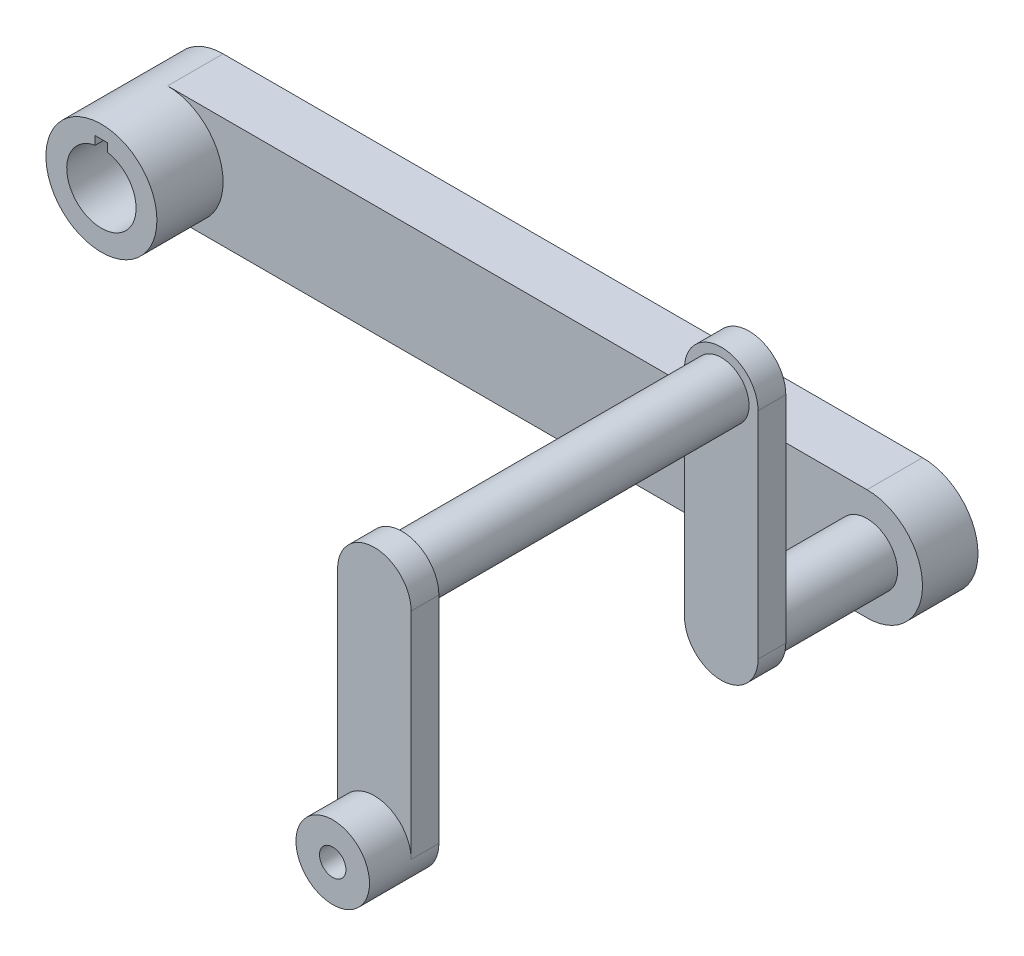
ISO-10303-21;
HEADER;
FILE_DESCRIPTION(('STEP AP214'),'2;1');
FILE_NAME('part.step','',(''),(''),'','','');
FILE_SCHEMA(('AUTOMOTIVE_DESIGN { 1 0 10303 214 1 1 1 1 }'));
ENDSEC;
DATA;
#1=APPLICATION_CONTEXT('core data for automotive mechanical design processes');
#2=APPLICATION_PROTOCOL_DEFINITION('international standard','automotive_design',2000,#1);
#3=PRODUCT_CONTEXT('',#1,'mechanical');
#4=PRODUCT('Part','Part','',(#3));
#5=PRODUCT_RELATED_PRODUCT_CATEGORY('part','',(#4));
#6=PRODUCT_DEFINITION_FORMATION('','',#4);
#7=PRODUCT_DEFINITION_CONTEXT('part definition',#1,'design');
#8=PRODUCT_DEFINITION('design','',#6,#7);
#9=PRODUCT_DEFINITION_SHAPE('','',#8);
#10=(LENGTH_UNIT() NAMED_UNIT(*) SI_UNIT(.MILLI.,.METRE.));
#11=(NAMED_UNIT(*) PLANE_ANGLE_UNIT() SI_UNIT($,.RADIAN.));
#12=(NAMED_UNIT(*) SI_UNIT($,.STERADIAN.) SOLID_ANGLE_UNIT());
#13=UNCERTAINTY_MEASURE_WITH_UNIT(LENGTH_MEASURE(1.E-05),#10,'distance_accuracy_value','');
#14=(GEOMETRIC_REPRESENTATION_CONTEXT(3) GLOBAL_UNCERTAINTY_ASSIGNED_CONTEXT((#13)) GLOBAL_UNIT_ASSIGNED_CONTEXT((#10,
#11,#12)) REPRESENTATION_CONTEXT('',''));
#15=CARTESIAN_POINT('',(0.,0.,0.));
#16=DIRECTION('',(0.,0.,1.));
#17=DIRECTION('',(1.,0.,0.));
#18=AXIS2_PLACEMENT_3D('',#15,#16,#17);
#19=CARTESIAN_POINT('',(50.4,0.,35.5));
#20=DIRECTION('',(0.,0.,-1.));
#21=DIRECTION('',(-1.,0.,0.));
#22=AXIS2_PLACEMENT_3D('',#19,#20,#21);
#23=CYLINDRICAL_SURFACE('',#22,0.950000000000001);
#24=CARTESIAN_POINT('',(50.4,0.,38.5));
#25=DIRECTION('',(0.,0.,1.));
#26=DIRECTION('',(1.,0.,0.));
#27=AXIS2_PLACEMENT_3D('',#24,#25,#26);
#28=CIRCLE('',#27,0.950000000000001);
#29=CARTESIAN_POINT('',(51.35,0.,38.5));
#30=VERTEX_POINT('',#29);
#31=EDGE_CURVE('E193',#30,#30,#28,.T.);
#32=ORIENTED_EDGE('',*,*,#31,.T.);
#33=EDGE_LOOP('',(#32));
#34=FACE_BOUND('',#33,.T.);
#35=CARTESIAN_POINT('',(50.4,0.,34.));
#36=DIRECTION('',(0.,0.,-1.));
#37=DIRECTION('',(-1.,0.,0.));
#38=AXIS2_PLACEMENT_3D('',#35,#36,#37);
#39=CIRCLE('',#38,0.950000000000001);
#40=CARTESIAN_POINT('',(49.45,0.,34.));
#41=VERTEX_POINT('',#40);
#42=EDGE_CURVE('E45',#41,#41,#39,.T.);
#43=ORIENTED_EDGE('',*,*,#42,.T.);
#44=EDGE_LOOP('',(#43));
#45=FACE_BOUND('',#44,.T.);
#46=ADVANCED_FACE('F41',(#34,#45),#23,.F.);
#47=CARTESIAN_POINT('',(0.,0.,-4.));
#48=DIRECTION('',(0.,0.,1.));
#49=DIRECTION('',(1.,0.,0.));
#50=AXIS2_PLACEMENT_3D('',#47,#48,#49);
#51=CYLINDRICAL_SURFACE('',#50,4.);
#52=DIRECTION('',(0.,0.,1.));
#53=VECTOR('',#52,1.);
#54=CARTESIAN_POINT('',(0.,-4.,-4.));
#55=LINE('',#54,#53);
#56=CARTESIAN_POINT('',(0.,-4.,-4.));
#57=VERTEX_POINT('',#56);
#58=CARTESIAN_POINT('',(0.,-4.,0.));
#59=VERTEX_POINT('',#58);
#60=EDGE_CURVE('E92',#57,#59,#55,.T.);
#61=ORIENTED_EDGE('',*,*,#60,.T.);
#62=CARTESIAN_POINT('',(0.,0.,0.));
#63=DIRECTION('',(0.,0.,1.));
#64=DIRECTION('',(1.,0.,0.));
#65=AXIS2_PLACEMENT_3D('',#62,#63,#64);
#66=CIRCLE('',#65,4.);
#67=CARTESIAN_POINT('',(0.,4.,0.));
#68=VERTEX_POINT('',#67);
#69=EDGE_CURVE('E11',#59,#68,#66,.T.);
#70=ORIENTED_EDGE('',*,*,#69,.T.);
#71=DIRECTION('',(0.,0.,1.));
#72=VECTOR('',#71,1.);
#73=CARTESIAN_POINT('',(0.,4.,-4.));
#74=LINE('',#73,#72);
#75=CARTESIAN_POINT('',(0.,4.,-4.));
#76=VERTEX_POINT('',#75);
#77=EDGE_CURVE('E50',#76,#68,#74,.T.);
#78=ORIENTED_EDGE('',*,*,#77,.F.);
#79=CARTESIAN_POINT('',(0.,0.,-4.));
#80=DIRECTION('',(0.,0.,1.));
#81=DIRECTION('',(1.,0.,0.));
#82=AXIS2_PLACEMENT_3D('',#79,#80,#81);
#83=CIRCLE('',#82,4.);
#84=EDGE_CURVE('E292',#76,#57,#83,.T.);
#85=ORIENTED_EDGE('',*,*,#84,.T.);
#86=EDGE_LOOP('',(#61,#70,#78,#85));
#87=FACE_BOUND('',#86,.T.);
#88=CARTESIAN_POINT('',(0.,0.,4.77));
#89=DIRECTION('',(0.,0.,1.));
#90=DIRECTION('',(1.,0.,0.));
#91=AXIS2_PLACEMENT_3D('',#88,#89,#90);
#92=CIRCLE('',#91,4.);
#93=CARTESIAN_POINT('',(4.,0.,4.77));
#94=VERTEX_POINT('',#93);
#95=EDGE_CURVE('E270',#94,#94,#92,.T.);
#96=ORIENTED_EDGE('',*,*,#95,.F.);
#97=EDGE_LOOP('',(#96));
#98=FACE_BOUND('',#97,.T.);
#99=ADVANCED_FACE('F43',(#87,#98),#51,.T.);
#100=CARTESIAN_POINT('',(0.,4.,-4.));
#101=DIRECTION('',(0.,1.,0.));
#102=DIRECTION('',(0.,0.,1.));
#103=AXIS2_PLACEMENT_3D('',#100,#101,#102);
#104=PLANE('',#103);
#105=DIRECTION('',(-1.,0.,0.));
#106=VECTOR('',#105,1.);
#107=CARTESIAN_POINT('',(0.,4.,0.));
#108=LINE('',#107,#106);
#109=CARTESIAN_POINT('',(50.4,4.,0.));
#110=VERTEX_POINT('',#109);
#111=EDGE_CURVE('E295',#110,#68,#108,.T.);
#112=ORIENTED_EDGE('',*,*,#111,.F.);
#113=DIRECTION('',(0.,0.,1.));
#114=VECTOR('',#113,1.);
#115=CARTESIAN_POINT('',(50.4,4.,-4.));
#116=LINE('',#115,#114);
#117=CARTESIAN_POINT('',(50.4,4.,-4.));
#118=VERTEX_POINT('',#117);
#119=EDGE_CURVE('E84',#118,#110,#116,.T.);
#120=ORIENTED_EDGE('',*,*,#119,.F.);
#121=DIRECTION('',(-1.,0.,0.));
#122=VECTOR('',#121,1.);
#123=CARTESIAN_POINT('',(0.,4.,-4.));
#124=LINE('',#123,#122);
#125=EDGE_CURVE('E299',#118,#76,#124,.T.);
#126=ORIENTED_EDGE('',*,*,#125,.T.);
#127=ORIENTED_EDGE('',*,*,#77,.T.);
#128=EDGE_LOOP('',(#112,#120,#126,#127));
#129=FACE_BOUND('',#128,.T.);
#130=ADVANCED_FACE('F316',(#129),#104,.T.);
#131=CARTESIAN_POINT('',(50.4,0.,-4.));
#132=DIRECTION('',(0.,0.,1.));
#133=DIRECTION('',(1.,0.,0.));
#134=AXIS2_PLACEMENT_3D('',#131,#132,#133);
#135=CYLINDRICAL_SURFACE('',#134,4.);
#136=CARTESIAN_POINT('',(50.4,0.,0.));
#137=DIRECTION('',(0.,0.,1.));
#138=DIRECTION('',(1.,0.,0.));
#139=AXIS2_PLACEMENT_3D('',#136,#137,#138);
#140=CIRCLE('',#139,4.);
#141=CARTESIAN_POINT('',(50.4,-4.,0.));
#142=VERTEX_POINT('',#141);
#143=EDGE_CURVE('E304',#142,#110,#140,.T.);
#144=ORIENTED_EDGE('',*,*,#143,.F.);
#145=DIRECTION('',(0.,0.,1.));
#146=VECTOR('',#145,1.);
#147=CARTESIAN_POINT('',(50.4,-4.,-4.));
#148=LINE('',#147,#146);
#149=CARTESIAN_POINT('',(50.4,-4.,-4.));
#150=VERTEX_POINT('',#149);
#151=EDGE_CURVE('E309',#150,#142,#148,.T.);
#152=ORIENTED_EDGE('',*,*,#151,.F.);
#153=CARTESIAN_POINT('',(50.4,0.,-4.));
#154=DIRECTION('',(0.,0.,1.));
#155=DIRECTION('',(1.,0.,0.));
#156=AXIS2_PLACEMENT_3D('',#153,#154,#155);
#157=CIRCLE('',#156,4.);
#158=EDGE_CURVE('E297',#150,#118,#157,.T.);
#159=ORIENTED_EDGE('',*,*,#158,.T.);
#160=ORIENTED_EDGE('',*,*,#119,.T.);
#161=EDGE_LOOP('',(#144,#152,#159,#160));
#162=FACE_BOUND('',#161,.T.);
#163=ADVANCED_FACE('F321',(#162),#135,.T.);
#164=CARTESIAN_POINT('',(0.,-4.,-4.));
#165=DIRECTION('',(0.,-1.,0.));
#166=DIRECTION('',(0.,0.,-1.));
#167=AXIS2_PLACEMENT_3D('',#164,#165,#166);
#168=PLANE('',#167);
#169=DIRECTION('',(1.,0.,0.));
#170=VECTOR('',#169,1.);
#171=CARTESIAN_POINT('',(0.,-4.,0.));
#172=LINE('',#171,#170);
#173=EDGE_CURVE('E286',#59,#142,#172,.T.);
#174=ORIENTED_EDGE('',*,*,#173,.F.);
#175=ORIENTED_EDGE('',*,*,#60,.F.);
#176=DIRECTION('',(1.,0.,0.));
#177=VECTOR('',#176,1.);
#178=CARTESIAN_POINT('',(0.,-4.,-4.));
#179=LINE('',#178,#177);
#180=EDGE_CURVE('E294',#57,#150,#179,.T.);
#181=ORIENTED_EDGE('',*,*,#180,.T.);
#182=ORIENTED_EDGE('',*,*,#151,.T.);
#183=EDGE_LOOP('',(#174,#175,#181,#182));
#184=FACE_BOUND('',#183,.T.);
#185=ADVANCED_FACE('F311',(#184),#168,.T.);
#186=CARTESIAN_POINT('',(0.,0.,-4.));
#187=DIRECTION('',(0.,0.,1.));
#188=DIRECTION('',(1.,0.,0.));
#189=AXIS2_PLACEMENT_3D('',#186,#187,#188);
#190=PLANE('',#189);
#191=DIRECTION('',(0.,-1.,0.));
#192=VECTOR('',#191,1.);
#193=CARTESIAN_POINT('',(-0.45,2.45916652547159,-4.));
#194=LINE('',#193,#192);
#195=CARTESIAN_POINT('',(-0.45,3.05916652547159,-4.));
#196=VERTEX_POINT('',#195);
#197=CARTESIAN_POINT('',(-0.45,2.45916652547159,-4.));
#198=VERTEX_POINT('',#197);
#199=EDGE_CURVE('E280',#196,#198,#194,.T.);
#200=ORIENTED_EDGE('',*,*,#199,.T.);
#201=CARTESIAN_POINT('',(0.,0.,-4.));
#202=DIRECTION('',(0.,0.,1.));
#203=DIRECTION('',(1.,0.,0.));
#204=AXIS2_PLACEMENT_3D('',#201,#202,#203);
#205=CIRCLE('',#204,2.5);
#206=CARTESIAN_POINT('',(0.45,2.45916652547159,-4.));
#207=VERTEX_POINT('',#206);
#208=EDGE_CURVE('E272',#198,#207,#205,.T.);
#209=ORIENTED_EDGE('',*,*,#208,.T.);
#210=DIRECTION('',(0.,1.,0.));
#211=VECTOR('',#210,1.);
#212=CARTESIAN_POINT('',(0.45,2.45916652547159,-4.));
#213=LINE('',#212,#211);
#214=CARTESIAN_POINT('',(0.45,3.05916652547159,-4.));
#215=VERTEX_POINT('',#214);
#216=EDGE_CURVE('E276',#207,#215,#213,.T.);
#217=ORIENTED_EDGE('',*,*,#216,.T.);
#218=DIRECTION('',(-1.,0.,0.));
#219=VECTOR('',#218,1.);
#220=CARTESIAN_POINT('',(-0.45,3.05916652547159,-4.));
#221=LINE('',#220,#219);
#222=EDGE_CURVE('E58',#215,#196,#221,.T.);
#223=ORIENTED_EDGE('',*,*,#222,.T.);
#224=EDGE_LOOP('',(#200,#209,#217,#223));
#225=FACE_BOUND('',#224,.T.);
#226=ORIENTED_EDGE('',*,*,#84,.F.);
#227=ORIENTED_EDGE('',*,*,#125,.F.);
#228=ORIENTED_EDGE('',*,*,#158,.F.);
#229=ORIENTED_EDGE('',*,*,#180,.F.);
#230=EDGE_LOOP('',(#226,#227,#228,#229));
#231=FACE_BOUND('',#230,.T.);
#232=ADVANCED_FACE('F320',(#225,#231),#190,.F.);
#233=CARTESIAN_POINT('',(0.,0.,0.));
#234=DIRECTION('',(0.,0.,1.));
#235=DIRECTION('',(1.,0.,0.));
#236=AXIS2_PLACEMENT_3D('',#233,#234,#235);
#237=PLANE('',#236);
#238=CARTESIAN_POINT('',(50.4,0.,0.));
#239=DIRECTION('',(0.,0.,1.));
#240=DIRECTION('',(1.,0.,0.));
#241=AXIS2_PLACEMENT_3D('',#238,#239,#240);
#242=CIRCLE('',#241,2.2);
#243=CARTESIAN_POINT('',(52.6,0.,0.));
#244=VERTEX_POINT('',#243);
#245=EDGE_CURVE('E252',#244,#244,#242,.T.);
#246=ORIENTED_EDGE('',*,*,#245,.F.);
#247=EDGE_LOOP('',(#246));
#248=FACE_BOUND('',#247,.T.);
#249=ORIENTED_EDGE('',*,*,#69,.F.);
#250=ORIENTED_EDGE('',*,*,#173,.T.);
#251=ORIENTED_EDGE('',*,*,#143,.T.);
#252=ORIENTED_EDGE('',*,*,#111,.T.);
#253=EDGE_LOOP('',(#249,#250,#251,#252));
#254=FACE_BOUND('',#253,.T.);
#255=ADVANCED_FACE('F313',(#248,#254),#237,.T.);
#256=CARTESIAN_POINT('',(0.,0.,-4.));
#257=DIRECTION('',(0.,0.,1.));
#258=DIRECTION('',(1.,0.,0.));
#259=AXIS2_PLACEMENT_3D('',#256,#257,#258);
#260=CYLINDRICAL_SURFACE('',#259,2.5);
#261=DIRECTION('',(0.,0.,1.));
#262=VECTOR('',#261,1.);
#263=CARTESIAN_POINT('',(-0.45,2.45916652547159,-4.));
#264=LINE('',#263,#262);
#265=CARTESIAN_POINT('',(-0.45,2.45916652547159,4.77));
#266=VERTEX_POINT('',#265);
#267=EDGE_CURVE('E284',#198,#266,#264,.T.);
#268=ORIENTED_EDGE('',*,*,#267,.T.);
#269=CARTESIAN_POINT('',(0.,0.,4.77));
#270=DIRECTION('',(0.,0.,1.));
#271=DIRECTION('',(1.,0.,0.));
#272=AXIS2_PLACEMENT_3D('',#269,#270,#271);
#273=CIRCLE('',#272,2.5);
#274=CARTESIAN_POINT('',(0.45,2.45916652547159,4.77));
#275=VERTEX_POINT('',#274);
#276=EDGE_CURVE('E264',#266,#275,#273,.T.);
#277=ORIENTED_EDGE('',*,*,#276,.T.);
#278=DIRECTION('',(0.,0.,1.));
#279=VECTOR('',#278,1.);
#280=CARTESIAN_POINT('',(0.45,2.45916652547159,-4.));
#281=LINE('',#280,#279);
#282=EDGE_CURVE('E283',#207,#275,#281,.T.);
#283=ORIENTED_EDGE('',*,*,#282,.F.);
#284=ORIENTED_EDGE('',*,*,#208,.F.);
#285=EDGE_LOOP('',(#268,#277,#283,#284));
#286=FACE_BOUND('',#285,.T.);
#287=ADVANCED_FACE('F401',(#286),#260,.F.);
#288=CARTESIAN_POINT('',(-0.45,2.45916652547159,-4.));
#289=DIRECTION('',(-1.,0.,0.));
#290=DIRECTION('',(0.,-1.,0.));
#291=AXIS2_PLACEMENT_3D('',#288,#289,#290);
#292=PLANE('',#291);
#293=DIRECTION('',(0.,0.,1.));
#294=VECTOR('',#293,1.);
#295=CARTESIAN_POINT('',(-0.45,3.05916652547159,-4.));
#296=LINE('',#295,#294);
#297=CARTESIAN_POINT('',(-0.45,3.05916652547159,4.77));
#298=VERTEX_POINT('',#297);
#299=EDGE_CURVE('E287',#196,#298,#296,.T.);
#300=ORIENTED_EDGE('',*,*,#299,.T.);
#301=DIRECTION('',(0.,-1.,0.));
#302=VECTOR('',#301,1.);
#303=CARTESIAN_POINT('',(-0.45,3.05916652547159,4.77));
#304=LINE('',#303,#302);
#305=EDGE_CURVE('E261',#298,#266,#304,.T.);
#306=ORIENTED_EDGE('',*,*,#305,.T.);
#307=ORIENTED_EDGE('',*,*,#267,.F.);
#308=ORIENTED_EDGE('',*,*,#199,.F.);
#309=EDGE_LOOP('',(#300,#306,#307,#308));
#310=FACE_BOUND('',#309,.T.);
#311=ADVANCED_FACE('F397',(#310),#292,.F.);
#312=CARTESIAN_POINT('',(-0.45,3.05916652547159,-4.));
#313=DIRECTION('',(0.,1.,0.));
#314=DIRECTION('',(0.,0.,1.));
#315=AXIS2_PLACEMENT_3D('',#312,#313,#314);
#316=PLANE('',#315);
#317=DIRECTION('',(0.,0.,1.));
#318=VECTOR('',#317,1.);
#319=CARTESIAN_POINT('',(0.45,3.05916652547159,-4.));
#320=LINE('',#319,#318);
#321=CARTESIAN_POINT('',(0.45,3.05916652547159,4.77));
#322=VERTEX_POINT('',#321);
#323=EDGE_CURVE('E289',#215,#322,#320,.T.);
#324=ORIENTED_EDGE('',*,*,#323,.T.);
#325=DIRECTION('',(-1.,0.,0.));
#326=VECTOR('',#325,1.);
#327=CARTESIAN_POINT('',(0.45,3.05916652547159,4.77));
#328=LINE('',#327,#326);
#329=EDGE_CURVE('E256',#322,#298,#328,.T.);
#330=ORIENTED_EDGE('',*,*,#329,.T.);
#331=ORIENTED_EDGE('',*,*,#299,.F.);
#332=ORIENTED_EDGE('',*,*,#222,.F.);
#333=EDGE_LOOP('',(#324,#330,#331,#332));
#334=FACE_BOUND('',#333,.T.);
#335=ADVANCED_FACE('F400',(#334),#316,.F.);
#336=CARTESIAN_POINT('',(0.45,2.45916652547159,-4.));
#337=DIRECTION('',(1.,0.,0.));
#338=DIRECTION('',(0.,0.,-1.));
#339=AXIS2_PLACEMENT_3D('',#336,#337,#338);
#340=PLANE('',#339);
#341=ORIENTED_EDGE('',*,*,#282,.T.);
#342=DIRECTION('',(0.,1.,0.));
#343=VECTOR('',#342,1.);
#344=CARTESIAN_POINT('',(0.45,2.45916652547159,4.77));
#345=LINE('',#344,#343);
#346=EDGE_CURVE('E267',#275,#322,#345,.T.);
#347=ORIENTED_EDGE('',*,*,#346,.T.);
#348=ORIENTED_EDGE('',*,*,#323,.F.);
#349=ORIENTED_EDGE('',*,*,#216,.F.);
#350=EDGE_LOOP('',(#341,#347,#348,#349));
#351=FACE_BOUND('',#350,.T.);
#352=ADVANCED_FACE('F395',(#351),#340,.F.);
#353=CARTESIAN_POINT('',(0.,0.,4.77));
#354=DIRECTION('',(0.,0.,1.));
#355=DIRECTION('',(1.,0.,0.));
#356=AXIS2_PLACEMENT_3D('',#353,#354,#355);
#357=PLANE('',#356);
#358=ORIENTED_EDGE('',*,*,#95,.T.);
#359=EDGE_LOOP('',(#358));
#360=FACE_BOUND('',#359,.T.);
#361=ORIENTED_EDGE('',*,*,#305,.F.);
#362=ORIENTED_EDGE('',*,*,#329,.F.);
#363=ORIENTED_EDGE('',*,*,#346,.F.);
#364=ORIENTED_EDGE('',*,*,#276,.F.);
#365=EDGE_LOOP('',(#361,#362,#363,#364));
#366=FACE_BOUND('',#365,.T.);
#367=ADVANCED_FACE('F391',(#360,#366),#357,.T.);
#368=CARTESIAN_POINT('',(50.4,0.,8.5));
#369=DIRECTION('',(0.,0.,-1.));
#370=DIRECTION('',(-1.,0.,0.));
#371=AXIS2_PLACEMENT_3D('',#368,#369,#370);
#372=CYLINDRICAL_SURFACE('',#371,2.2);
#373=CARTESIAN_POINT('',(50.4,0.,8.5));
#374=DIRECTION('',(0.,0.,1.));
#375=DIRECTION('',(1.,0.,0.));
#376=AXIS2_PLACEMENT_3D('',#373,#374,#375);
#377=CIRCLE('',#376,2.2);
#378=CARTESIAN_POINT('',(52.6,0.,8.5));
#379=VERTEX_POINT('',#378);
#380=EDGE_CURVE('E253',#379,#379,#377,.T.);
#381=ORIENTED_EDGE('',*,*,#380,.F.);
#382=EDGE_LOOP('',(#381));
#383=FACE_BOUND('',#382,.T.);
#384=ORIENTED_EDGE('',*,*,#245,.T.);
#385=EDGE_LOOP('',(#384));
#386=FACE_BOUND('',#385,.T.);
#387=ADVANCED_FACE('F387',(#383,#386),#372,.T.);
#388=CARTESIAN_POINT('',(50.4,15.5,10.5));
#389=DIRECTION('',(0.,0.,-1.));
#390=DIRECTION('',(-1.,0.,0.));
#391=AXIS2_PLACEMENT_3D('',#388,#389,#390);
#392=CYLINDRICAL_SURFACE('',#391,2.65);
#393=CARTESIAN_POINT('',(50.4,15.5,8.5));
#394=DIRECTION('',(0.,0.,1.));
#395=DIRECTION('',(1.,0.,0.));
#396=AXIS2_PLACEMENT_3D('',#393,#394,#395);
#397=CIRCLE('',#396,2.65);
#398=CARTESIAN_POINT('',(53.05,15.5,8.5));
#399=VERTEX_POINT('',#398);
#400=CARTESIAN_POINT('',(47.75,15.5,8.5));
#401=VERTEX_POINT('',#400);
#402=EDGE_CURVE('E220',#399,#401,#397,.T.);
#403=ORIENTED_EDGE('',*,*,#402,.T.);
#404=DIRECTION('',(0.,0.,-1.));
#405=VECTOR('',#404,1.);
#406=CARTESIAN_POINT('',(47.75,15.5,10.5));
#407=LINE('',#406,#405);
#408=CARTESIAN_POINT('',(47.75,15.5,10.5));
#409=VERTEX_POINT('',#408);
#410=EDGE_CURVE('E249',#409,#401,#407,.T.);
#411=ORIENTED_EDGE('',*,*,#410,.F.);
#412=CARTESIAN_POINT('',(50.4,15.5,10.5));
#413=DIRECTION('',(0.,0.,1.));
#414=DIRECTION('',(1.,0.,0.));
#415=AXIS2_PLACEMENT_3D('',#412,#413,#414);
#416=CIRCLE('',#415,2.65);
#417=CARTESIAN_POINT('',(53.05,15.5,10.5));
#418=VERTEX_POINT('',#417);
#419=EDGE_CURVE('E223',#418,#409,#416,.T.);
#420=ORIENTED_EDGE('',*,*,#419,.F.);
#421=DIRECTION('',(0.,0.,-1.));
#422=VECTOR('',#421,1.);
#423=CARTESIAN_POINT('',(53.05,15.5,10.5));
#424=LINE('',#423,#422);
#425=EDGE_CURVE('E233',#418,#399,#424,.T.);
#426=ORIENTED_EDGE('',*,*,#425,.T.);
#427=EDGE_LOOP('',(#403,#411,#420,#426));
#428=FACE_BOUND('',#427,.T.);
#429=ADVANCED_FACE('F383',(#428),#392,.T.);
#430=CARTESIAN_POINT('',(47.75,15.5,10.5));
#431=DIRECTION('',(1.,0.,0.));
#432=DIRECTION('',(0.,1.,0.));
#433=AXIS2_PLACEMENT_3D('',#430,#431,#432);
#434=PLANE('',#433);
#435=DIRECTION('',(0.,-1.,0.));
#436=VECTOR('',#435,1.);
#437=CARTESIAN_POINT('',(47.75,15.5,8.5));
#438=LINE('',#437,#436);
#439=CARTESIAN_POINT('',(47.75,0.,8.5));
#440=VERTEX_POINT('',#439);
#441=EDGE_CURVE('E236',#401,#440,#438,.T.);
#442=ORIENTED_EDGE('',*,*,#441,.T.);
#443=DIRECTION('',(0.,0.,-1.));
#444=VECTOR('',#443,1.);
#445=CARTESIAN_POINT('',(47.75,0.,10.5));
#446=LINE('',#445,#444);
#447=CARTESIAN_POINT('',(47.75,0.,10.5));
#448=VERTEX_POINT('',#447);
#449=EDGE_CURVE('E246',#448,#440,#446,.T.);
#450=ORIENTED_EDGE('',*,*,#449,.F.);
#451=DIRECTION('',(0.,-1.,0.));
#452=VECTOR('',#451,1.);
#453=CARTESIAN_POINT('',(47.75,15.5,10.5));
#454=LINE('',#453,#452);
#455=EDGE_CURVE('E226',#409,#448,#454,.T.);
#456=ORIENTED_EDGE('',*,*,#455,.F.);
#457=ORIENTED_EDGE('',*,*,#410,.T.);
#458=EDGE_LOOP('',(#442,#450,#456,#457));
#459=FACE_BOUND('',#458,.T.);
#460=ADVANCED_FACE('F379',(#459),#434,.F.);
#461=CARTESIAN_POINT('',(50.4,0.,10.5));
#462=DIRECTION('',(0.,0.,-1.));
#463=DIRECTION('',(-1.,0.,0.));
#464=AXIS2_PLACEMENT_3D('',#461,#462,#463);
#465=CYLINDRICAL_SURFACE('',#464,2.65);
#466=CARTESIAN_POINT('',(50.4,0.,8.5));
#467=DIRECTION('',(0.,0.,1.));
#468=DIRECTION('',(1.,0.,0.));
#469=AXIS2_PLACEMENT_3D('',#466,#467,#468);
#470=CIRCLE('',#469,2.65);
#471=CARTESIAN_POINT('',(53.05,0.,8.5));
#472=VERTEX_POINT('',#471);
#473=EDGE_CURVE('E238',#440,#472,#470,.T.);
#474=ORIENTED_EDGE('',*,*,#473,.T.);
#475=DIRECTION('',(0.,0.,-1.));
#476=VECTOR('',#475,1.);
#477=CARTESIAN_POINT('',(53.05,0.,10.5));
#478=LINE('',#477,#476);
#479=CARTESIAN_POINT('',(53.05,0.,10.5));
#480=VERTEX_POINT('',#479);
#481=EDGE_CURVE('E243',#480,#472,#478,.T.);
#482=ORIENTED_EDGE('',*,*,#481,.F.);
#483=CARTESIAN_POINT('',(50.4,0.,10.5));
#484=DIRECTION('',(0.,0.,1.));
#485=DIRECTION('',(1.,0.,0.));
#486=AXIS2_PLACEMENT_3D('',#483,#484,#485);
#487=CIRCLE('',#486,2.65);
#488=EDGE_CURVE('E229',#448,#480,#487,.T.);
#489=ORIENTED_EDGE('',*,*,#488,.F.);
#490=ORIENTED_EDGE('',*,*,#449,.T.);
#491=EDGE_LOOP('',(#474,#482,#489,#490));
#492=FACE_BOUND('',#491,.T.);
#493=ADVANCED_FACE('F375',(#492),#465,.T.);
#494=CARTESIAN_POINT('',(53.05,15.5,10.5));
#495=DIRECTION('',(-1.,0.,0.));
#496=DIRECTION('',(0.,-1.,0.));
#497=AXIS2_PLACEMENT_3D('',#494,#495,#496);
#498=PLANE('',#497);
#499=DIRECTION('',(0.,1.,0.));
#500=VECTOR('',#499,1.);
#501=CARTESIAN_POINT('',(53.05,15.5,8.5));
#502=LINE('',#501,#500);
#503=EDGE_CURVE('E227',#472,#399,#502,.T.);
#504=ORIENTED_EDGE('',*,*,#503,.T.);
#505=ORIENTED_EDGE('',*,*,#425,.F.);
#506=DIRECTION('',(0.,1.,0.));
#507=VECTOR('',#506,1.);
#508=CARTESIAN_POINT('',(53.05,15.5,10.5));
#509=LINE('',#508,#507);
#510=EDGE_CURVE('E231',#480,#418,#509,.T.);
#511=ORIENTED_EDGE('',*,*,#510,.F.);
#512=ORIENTED_EDGE('',*,*,#481,.T.);
#513=EDGE_LOOP('',(#504,#505,#511,#512));
#514=FACE_BOUND('',#513,.T.);
#515=ADVANCED_FACE('F368',(#514),#498,.F.);
#516=CARTESIAN_POINT('',(50.4,15.5,10.5));
#517=DIRECTION('',(0.,0.,1.));
#518=DIRECTION('',(1.,0.,0.));
#519=AXIS2_PLACEMENT_3D('',#516,#517,#518);
#520=PLANE('',#519);
#521=CARTESIAN_POINT('',(50.4,15.5,10.5));
#522=DIRECTION('',(0.,0.,1.));
#523=DIRECTION('',(1.,0.,0.));
#524=AXIS2_PLACEMENT_3D('',#521,#522,#523);
#525=CIRCLE('',#524,2.);
#526=CARTESIAN_POINT('',(52.4,15.5,10.5));
#527=VERTEX_POINT('',#526);
#528=EDGE_CURVE('E216',#527,#527,#525,.T.);
#529=ORIENTED_EDGE('',*,*,#528,.F.);
#530=EDGE_LOOP('',(#529));
#531=FACE_BOUND('',#530,.T.);
#532=ORIENTED_EDGE('',*,*,#419,.T.);
#533=ORIENTED_EDGE('',*,*,#455,.T.);
#534=ORIENTED_EDGE('',*,*,#488,.T.);
#535=ORIENTED_EDGE('',*,*,#510,.T.);
#536=EDGE_LOOP('',(#532,#533,#534,#535));
#537=FACE_BOUND('',#536,.T.);
#538=ADVANCED_FACE('F365',(#531,#537),#520,.T.);
#539=CARTESIAN_POINT('',(50.4,15.5,8.5));
#540=DIRECTION('',(0.,0.,1.));
#541=DIRECTION('',(1.,0.,0.));
#542=AXIS2_PLACEMENT_3D('',#539,#540,#541);
#543=PLANE('',#542);
#544=ORIENTED_EDGE('',*,*,#380,.T.);
#545=EDGE_LOOP('',(#544));
#546=FACE_BOUND('',#545,.T.);
#547=ORIENTED_EDGE('',*,*,#402,.F.);
#548=ORIENTED_EDGE('',*,*,#503,.F.);
#549=ORIENTED_EDGE('',*,*,#473,.F.);
#550=ORIENTED_EDGE('',*,*,#441,.F.);
#551=EDGE_LOOP('',(#547,#548,#549,#550));
#552=FACE_BOUND('',#551,.T.);
#553=ADVANCED_FACE('F363',(#546,#552),#543,.F.);
#554=CARTESIAN_POINT('',(50.4,15.5,33.5));
#555=DIRECTION('',(0.,0.,-1.));
#556=DIRECTION('',(-1.,0.,0.));
#557=AXIS2_PLACEMENT_3D('',#554,#555,#556);
#558=CYLINDRICAL_SURFACE('',#557,2.);
#559=CARTESIAN_POINT('',(50.4,15.5,33.5));
#560=DIRECTION('',(0.,0.,1.));
#561=DIRECTION('',(1.,0.,0.));
#562=AXIS2_PLACEMENT_3D('',#559,#560,#561);
#563=CIRCLE('',#562,2.);
#564=CARTESIAN_POINT('',(52.4,15.5,33.5));
#565=VERTEX_POINT('',#564);
#566=EDGE_CURVE('E217',#565,#565,#563,.T.);
#567=ORIENTED_EDGE('',*,*,#566,.F.);
#568=EDGE_LOOP('',(#567));
#569=FACE_BOUND('',#568,.T.);
#570=ORIENTED_EDGE('',*,*,#528,.T.);
#571=EDGE_LOOP('',(#570));
#572=FACE_BOUND('',#571,.T.);
#573=ADVANCED_FACE('F346',(#569,#572),#558,.T.);
#574=CARTESIAN_POINT('',(50.4,15.5,35.5));
#575=DIRECTION('',(0.,0.,1.));
#576=DIRECTION('',(1.,0.,0.));
#577=AXIS2_PLACEMENT_3D('',#574,#575,#576);
#578=PLANE('',#577);
#579=CARTESIAN_POINT('',(50.4,0.,35.5));
#580=DIRECTION('',(0.,0.,1.));
#581=DIRECTION('',(1.,0.,0.));
#582=AXIS2_PLACEMENT_3D('',#579,#580,#581);
#583=CIRCLE('',#582,2.65);
#584=CARTESIAN_POINT('',(53.05,0.,35.5));
#585=VERTEX_POINT('',#584);
#586=CARTESIAN_POINT('',(47.75,0.,35.5));
#587=VERTEX_POINT('',#586);
#588=EDGE_CURVE('E185',#585,#587,#583,.T.);
#589=ORIENTED_EDGE('',*,*,#588,.F.);
#590=DIRECTION('',(0.,1.,0.));
#591=VECTOR('',#590,1.);
#592=CARTESIAN_POINT('',(53.05,15.5,35.5));
#593=LINE('',#592,#591);
#594=CARTESIAN_POINT('',(53.05,15.5,35.5));
#595=VERTEX_POINT('',#594);
#596=EDGE_CURVE('E167',#585,#595,#593,.T.);
#597=ORIENTED_EDGE('',*,*,#596,.T.);
#598=CARTESIAN_POINT('',(50.4,15.5,35.5));
#599=DIRECTION('',(0.,0.,1.));
#600=DIRECTION('',(1.,0.,0.));
#601=AXIS2_PLACEMENT_3D('',#598,#599,#600);
#602=CIRCLE('',#601,2.65);
#603=CARTESIAN_POINT('',(47.75,15.5,35.5));
#604=VERTEX_POINT('',#603);
#605=EDGE_CURVE('E201',#595,#604,#602,.T.);
#606=ORIENTED_EDGE('',*,*,#605,.T.);
#607=DIRECTION('',(0.,-1.,0.));
#608=VECTOR('',#607,1.);
#609=CARTESIAN_POINT('',(47.75,15.5,35.5));
#610=LINE('',#609,#608);
#611=EDGE_CURVE('E178',#604,#587,#610,.T.);
#612=ORIENTED_EDGE('',*,*,#611,.T.);
#613=EDGE_LOOP('',(#589,#597,#606,#612));
#614=FACE_BOUND('',#613,.T.);
#615=ADVANCED_FACE('F190',(#614),#578,.T.);
#616=CARTESIAN_POINT('',(50.4,15.5,33.5));
#617=DIRECTION('',(0.,0.,1.));
#618=DIRECTION('',(1.,0.,0.));
#619=AXIS2_PLACEMENT_3D('',#616,#617,#618);
#620=PLANE('',#619);
#621=CARTESIAN_POINT('',(50.4,0.,33.5));
#622=DIRECTION('',(0.,0.,-1.));
#623=DIRECTION('',(-1.,0.,0.));
#624=AXIS2_PLACEMENT_3D('',#621,#622,#623);
#625=CIRCLE('',#624,1.25);
#626=CARTESIAN_POINT('',(49.15,0.,33.5));
#627=VERTEX_POINT('',#626);
#628=EDGE_CURVE('E531',#627,#627,#625,.T.);
#629=ORIENTED_EDGE('',*,*,#628,.F.);
#630=EDGE_LOOP('',(#629));
#631=FACE_BOUND('',#630,.T.);
#632=ORIENTED_EDGE('',*,*,#566,.T.);
#633=EDGE_LOOP('',(#632));
#634=FACE_BOUND('',#633,.T.);
#635=CARTESIAN_POINT('',(50.4,15.5,33.5));
#636=DIRECTION('',(0.,0.,1.));
#637=DIRECTION('',(1.,0.,0.));
#638=AXIS2_PLACEMENT_3D('',#635,#636,#637);
#639=CIRCLE('',#638,2.65);
#640=CARTESIAN_POINT('',(53.05,15.5,33.5));
#641=VERTEX_POINT('',#640);
#642=CARTESIAN_POINT('',(47.75,15.5,33.5));
#643=VERTEX_POINT('',#642);
#644=EDGE_CURVE('E196',#641,#643,#639,.T.);
#645=ORIENTED_EDGE('',*,*,#644,.F.);
#646=DIRECTION('',(0.,1.,0.));
#647=VECTOR('',#646,1.);
#648=CARTESIAN_POINT('',(53.05,15.5,33.5));
#649=LINE('',#648,#647);
#650=CARTESIAN_POINT('',(53.05,0.,33.5));
#651=VERTEX_POINT('',#650);
#652=EDGE_CURVE('E203',#651,#641,#649,.T.);
#653=ORIENTED_EDGE('',*,*,#652,.F.);
#654=CARTESIAN_POINT('',(50.4,0.,33.5));
#655=DIRECTION('',(0.,0.,1.));
#656=DIRECTION('',(1.,0.,0.));
#657=AXIS2_PLACEMENT_3D('',#654,#655,#656);
#658=CIRCLE('',#657,2.65);
#659=CARTESIAN_POINT('',(47.75,0.,33.5));
#660=VERTEX_POINT('',#659);
#661=EDGE_CURVE('E187',#660,#651,#658,.T.);
#662=ORIENTED_EDGE('',*,*,#661,.F.);
#663=DIRECTION('',(0.,-1.,0.));
#664=VECTOR('',#663,1.);
#665=CARTESIAN_POINT('',(47.75,15.5,33.5));
#666=LINE('',#665,#664);
#667=EDGE_CURVE('E207',#643,#660,#666,.T.);
#668=ORIENTED_EDGE('',*,*,#667,.F.);
#669=EDGE_LOOP('',(#645,#653,#662,#668));
#670=FACE_BOUND('',#669,.T.);
#671=ADVANCED_FACE('F345',(#631,#634,#670),#620,.F.);
#672=CARTESIAN_POINT('',(50.4,15.5,35.5));
#673=DIRECTION('',(0.,0.,-1.));
#674=DIRECTION('',(-1.,0.,0.));
#675=AXIS2_PLACEMENT_3D('',#672,#673,#674);
#676=CYLINDRICAL_SURFACE('',#675,2.65);
#677=ORIENTED_EDGE('',*,*,#644,.T.);
#678=DIRECTION('',(0.,0.,-1.));
#679=VECTOR('',#678,1.);
#680=CARTESIAN_POINT('',(47.75,15.5,35.5));
#681=LINE('',#680,#679);
#682=EDGE_CURVE('E213',#604,#643,#681,.T.);
#683=ORIENTED_EDGE('',*,*,#682,.F.);
#684=ORIENTED_EDGE('',*,*,#605,.F.);
#685=DIRECTION('',(0.,0.,-1.));
#686=VECTOR('',#685,1.);
#687=CARTESIAN_POINT('',(53.05,15.5,35.5));
#688=LINE('',#687,#686);
#689=EDGE_CURVE('E173',#595,#641,#688,.T.);
#690=ORIENTED_EDGE('',*,*,#689,.T.);
#691=EDGE_LOOP('',(#677,#683,#684,#690));
#692=FACE_BOUND('',#691,.T.);
#693=ADVANCED_FACE('F348',(#692),#676,.T.);
#694=CARTESIAN_POINT('',(47.75,15.5,35.5));
#695=DIRECTION('',(1.,0.,0.));
#696=DIRECTION('',(0.,0.,-1.));
#697=AXIS2_PLACEMENT_3D('',#694,#695,#696);
#698=PLANE('',#697);
#699=ORIENTED_EDGE('',*,*,#667,.T.);
#700=DIRECTION('',(0.,0.,-1.));
#701=VECTOR('',#700,1.);
#702=CARTESIAN_POINT('',(47.75,0.,35.5));
#703=LINE('',#702,#701);
#704=EDGE_CURVE('E188',#587,#660,#703,.T.);
#705=ORIENTED_EDGE('',*,*,#704,.F.);
#706=ORIENTED_EDGE('',*,*,#611,.F.);
#707=ORIENTED_EDGE('',*,*,#682,.T.);
#708=EDGE_LOOP('',(#699,#705,#706,#707));
#709=FACE_BOUND('',#708,.T.);
#710=ADVANCED_FACE('F354',(#709),#698,.F.);
#711=CARTESIAN_POINT('',(50.4,0.,35.5));
#712=DIRECTION('',(0.,0.,-1.));
#713=DIRECTION('',(-1.,0.,0.));
#714=AXIS2_PLACEMENT_3D('',#711,#712,#713);
#715=CYLINDRICAL_SURFACE('',#714,2.65);
#716=ORIENTED_EDGE('',*,*,#661,.T.);
#717=DIRECTION('',(0.,0.,-1.));
#718=VECTOR('',#717,1.);
#719=CARTESIAN_POINT('',(53.05,0.,35.5));
#720=LINE('',#719,#718);
#721=EDGE_CURVE('E170',#585,#651,#720,.T.);
#722=ORIENTED_EDGE('',*,*,#721,.F.);
#723=ORIENTED_EDGE('',*,*,#588,.T.);
#724=ORIENTED_EDGE('',*,*,#704,.T.);
#725=EDGE_LOOP('',(#716,#722,#723,#724));
#726=FACE_BOUND('',#725,.T.);
#727=CARTESIAN_POINT('',(50.4,0.,38.5));
#728=DIRECTION('',(0.,0.,1.));
#729=DIRECTION('',(1.,0.,0.));
#730=AXIS2_PLACEMENT_3D('',#727,#728,#729);
#731=CIRCLE('',#730,2.65);
#732=CARTESIAN_POINT('',(53.05,0.,38.5));
#733=VERTEX_POINT('',#732);
#734=EDGE_CURVE('E192',#733,#733,#731,.T.);
#735=ORIENTED_EDGE('',*,*,#734,.F.);
#736=EDGE_LOOP('',(#735));
#737=FACE_BOUND('',#736,.T.);
#738=ADVANCED_FACE('F182',(#726,#737),#715,.T.);
#739=CARTESIAN_POINT('',(53.05,15.5,35.5));
#740=DIRECTION('',(-1.,0.,0.));
#741=DIRECTION('',(0.,0.,1.));
#742=AXIS2_PLACEMENT_3D('',#739,#740,#741);
#743=PLANE('',#742);
#744=ORIENTED_EDGE('',*,*,#652,.T.);
#745=ORIENTED_EDGE('',*,*,#689,.F.);
#746=ORIENTED_EDGE('',*,*,#596,.F.);
#747=ORIENTED_EDGE('',*,*,#721,.T.);
#748=EDGE_LOOP('',(#744,#745,#746,#747));
#749=FACE_BOUND('',#748,.T.);
#750=ADVANCED_FACE('F169',(#749),#743,.F.);
#751=CARTESIAN_POINT('',(50.4,0.,38.5));
#752=DIRECTION('',(0.,0.,1.));
#753=DIRECTION('',(1.,0.,0.));
#754=AXIS2_PLACEMENT_3D('',#751,#752,#753);
#755=PLANE('',#754);
#756=ORIENTED_EDGE('',*,*,#734,.T.);
#757=EDGE_LOOP('',(#756));
#758=FACE_BOUND('',#757,.T.);
#759=ORIENTED_EDGE('',*,*,#31,.F.);
#760=EDGE_LOOP('',(#759));
#761=FACE_BOUND('',#760,.T.);
#762=ADVANCED_FACE('F341',(#758,#761),#755,.T.);
#763=CARTESIAN_POINT('',(50.4,0.,34.));
#764=DIRECTION('',(0.,0.,-1.));
#765=DIRECTION('',(-1.,0.,0.));
#766=AXIS2_PLACEMENT_3D('',#763,#764,#765);
#767=CYLINDRICAL_SURFACE('',#766,1.25);
#768=CARTESIAN_POINT('',(50.4,0.,34.));
#769=DIRECTION('',(0.,0.,-1.));
#770=DIRECTION('',(-1.,0.,0.));
#771=AXIS2_PLACEMENT_3D('',#768,#769,#770);
#772=CIRCLE('',#771,1.25);
#773=CARTESIAN_POINT('',(49.15,0.,34.));
#774=VERTEX_POINT('',#773);
#775=EDGE_CURVE('E530',#774,#774,#772,.T.);
#776=ORIENTED_EDGE('',*,*,#775,.F.);
#777=EDGE_LOOP('',(#776));
#778=FACE_BOUND('',#777,.T.);
#779=ORIENTED_EDGE('',*,*,#628,.T.);
#780=EDGE_LOOP('',(#779));
#781=FACE_BOUND('',#780,.T.);
#782=ADVANCED_FACE('F494',(#778,#781),#767,.F.);
#783=CARTESIAN_POINT('',(50.4,0.,34.));
#784=DIRECTION('',(0.,0.,-1.));
#785=DIRECTION('',(-1.,0.,0.));
#786=AXIS2_PLACEMENT_3D('',#783,#784,#785);
#787=PLANE('',#786);
#788=ORIENTED_EDGE('',*,*,#42,.F.);
#789=EDGE_LOOP('',(#788));
#790=FACE_BOUND('',#789,.T.);
#791=ORIENTED_EDGE('',*,*,#775,.T.);
#792=EDGE_LOOP('',(#791));
#793=FACE_BOUND('',#792,.T.);
#794=ADVANCED_FACE('F513',(#790,#793),#787,.T.);
#795=CLOSED_SHELL('',(#46,#99,#130,#163,#185,#232,#255,#287,#311,#335,#352,#367,#387,#429,#460,
#493,#515,#538,#553,#573,#615,#671,#693,#710,#738,#750,#762,#782,#794));
#796=MANIFOLD_SOLID_BREP('B2',#795);
#797=ADVANCED_BREP_SHAPE_REPRESENTATION('',(#18,#796),#14);
#798=SHAPE_DEFINITION_REPRESENTATION(#9,#797);
ENDSEC;
END-ISO-10303-21;
